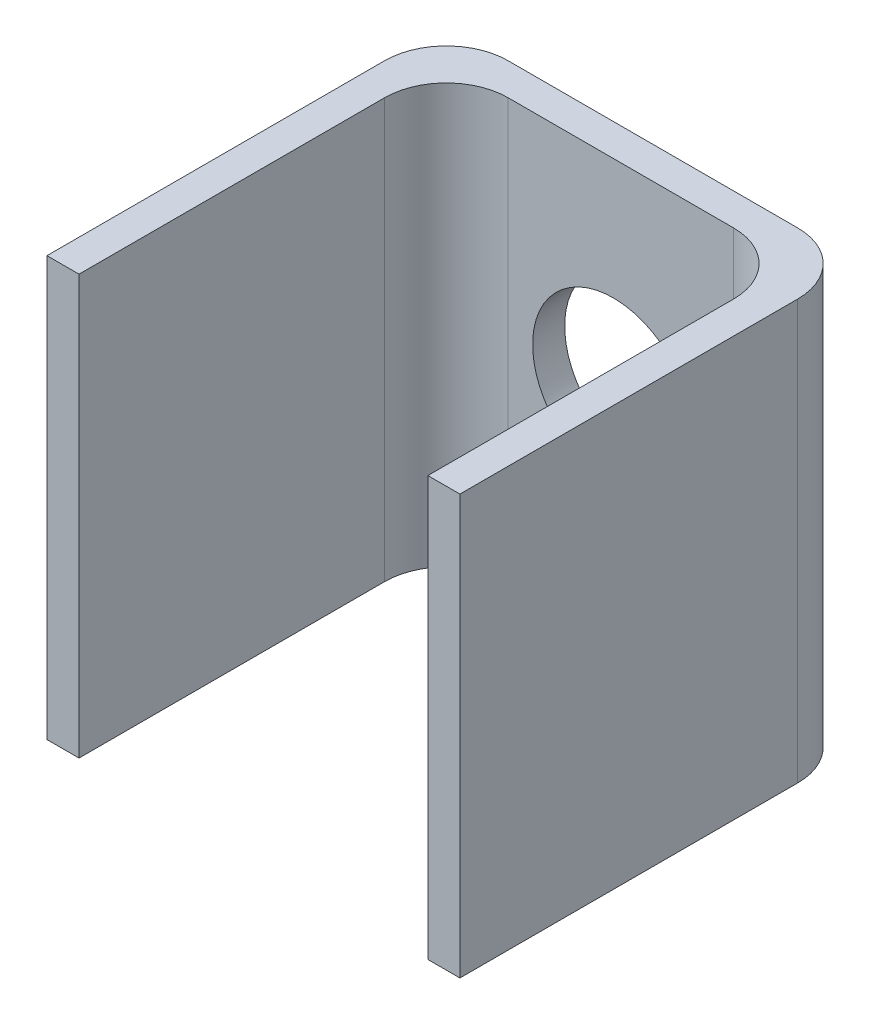
ISO-10303-21;
HEADER;
FILE_DESCRIPTION(('STEP AP214'),'2;1');
FILE_NAME('part.step','',(''),(''),'','','');
FILE_SCHEMA(('AUTOMOTIVE_DESIGN { 1 0 10303 214 1 1 1 1 }'));
ENDSEC;
DATA;
#1=APPLICATION_CONTEXT('core data for automotive mechanical design processes');
#2=APPLICATION_PROTOCOL_DEFINITION('international standard','automotive_design',2000,#1);
#3=PRODUCT_CONTEXT('',#1,'mechanical');
#4=PRODUCT('Part','Part','',(#3));
#5=PRODUCT_RELATED_PRODUCT_CATEGORY('part','',(#4));
#6=PRODUCT_DEFINITION_FORMATION('','',#4);
#7=PRODUCT_DEFINITION_CONTEXT('part definition',#1,'design');
#8=PRODUCT_DEFINITION('design','',#6,#7);
#9=PRODUCT_DEFINITION_SHAPE('','',#8);
#10=(LENGTH_UNIT() NAMED_UNIT(*) SI_UNIT(.MILLI.,.METRE.));
#11=(NAMED_UNIT(*) PLANE_ANGLE_UNIT() SI_UNIT($,.RADIAN.));
#12=(NAMED_UNIT(*) SI_UNIT($,.STERADIAN.) SOLID_ANGLE_UNIT());
#13=UNCERTAINTY_MEASURE_WITH_UNIT(LENGTH_MEASURE(1.E-05),#10,'distance_accuracy_value','');
#14=(GEOMETRIC_REPRESENTATION_CONTEXT(3) GLOBAL_UNCERTAINTY_ASSIGNED_CONTEXT((#13)) GLOBAL_UNIT_ASSIGNED_CONTEXT((#10,
#11,#12)) REPRESENTATION_CONTEXT('',''));
#15=CARTESIAN_POINT('',(0.,0.,0.));
#16=DIRECTION('',(0.,0.,1.));
#17=DIRECTION('',(1.,0.,0.));
#18=AXIS2_PLACEMENT_3D('',#15,#16,#17);
#19=CARTESIAN_POINT('',(-5.74929172377862,2.7494592022072,1.27));
#20=DIRECTION('',(0.,1.,0.));
#21=DIRECTION('',(0.,0.,1.));
#22=AXIS2_PLACEMENT_3D('',#19,#20,#21);
#23=CYLINDRICAL_SURFACE('',#22,1.27);
#24=CARTESIAN_POINT('',(-5.74929172377862,11.3854592022072,1.27));
#25=DIRECTION('',(0.,1.,0.));
#26=DIRECTION('',(0.,0.,1.));
#27=AXIS2_PLACEMENT_3D('',#24,#25,#26);
#28=CIRCLE('',#27,1.27);
#29=CARTESIAN_POINT('',(-4.47929172377862,11.3854592022072,1.27));
#30=VERTEX_POINT('',#29);
#31=CARTESIAN_POINT('',(-5.74929172377862,11.3854592022072,0.));
#32=VERTEX_POINT('',#31);
#33=EDGE_CURVE('E153',#30,#32,#28,.T.);
#34=ORIENTED_EDGE('',*,*,#33,.F.);
#35=DIRECTION('',(0.,1.,0.));
#36=VECTOR('',#35,1.);
#37=CARTESIAN_POINT('',(-4.47929172377862,2.7494592022072,1.27));
#38=LINE('',#37,#36);
#39=CARTESIAN_POINT('',(-4.47929172377862,2.7494592022072,1.27));
#40=VERTEX_POINT('',#39);
#41=EDGE_CURVE('E11',#40,#30,#38,.T.);
#42=ORIENTED_EDGE('',*,*,#41,.F.);
#43=CARTESIAN_POINT('',(-5.74929172377862,2.7494592022072,1.27));
#44=DIRECTION('',(0.,1.,0.));
#45=DIRECTION('',(0.,0.,1.));
#46=AXIS2_PLACEMENT_3D('',#43,#44,#45);
#47=CIRCLE('',#46,1.27);
#48=CARTESIAN_POINT('',(-5.74929172377862,2.7494592022072,0.));
#49=VERTEX_POINT('',#48);
#50=EDGE_CURVE('E186',#40,#49,#47,.T.);
#51=ORIENTED_EDGE('',*,*,#50,.T.);
#52=DIRECTION('',(0.,1.,0.));
#53=VECTOR('',#52,1.);
#54=CARTESIAN_POINT('',(-5.74929172377862,2.7494592022072,0.));
#55=LINE('',#54,#53);
#56=EDGE_CURVE('E35',#49,#32,#55,.T.);
#57=ORIENTED_EDGE('',*,*,#56,.T.);
#58=EDGE_LOOP('',(#34,#42,#51,#57));
#59=FACE_BOUND('',#58,.T.);
#60=ADVANCED_FACE('F32',(#59),#23,.T.);
#61=CARTESIAN_POINT('',(-4.47929172377862,2.7494592022072,8.2296));
#62=DIRECTION('',(1.,0.,0.));
#63=DIRECTION('',(0.,0.,-1.));
#64=AXIS2_PLACEMENT_3D('',#61,#62,#63);
#65=PLANE('',#64);
#66=DIRECTION('',(0.,0.,-1.));
#67=VECTOR('',#66,1.);
#68=CARTESIAN_POINT('',(-4.47929172377862,11.3854592022072,8.2296));
#69=LINE('',#68,#67);
#70=CARTESIAN_POINT('',(-4.47929172377862,11.3854592022072,8.2296));
#71=VERTEX_POINT('',#70);
#72=EDGE_CURVE('E184',#71,#30,#69,.T.);
#73=ORIENTED_EDGE('',*,*,#72,.F.);
#74=DIRECTION('',(0.,1.,0.));
#75=VECTOR('',#74,1.);
#76=CARTESIAN_POINT('',(-4.47929172377862,2.7494592022072,8.2296));
#77=LINE('',#76,#75);
#78=CARTESIAN_POINT('',(-4.47929172377862,2.7494592022072,8.2296));
#79=VERTEX_POINT('',#78);
#80=EDGE_CURVE('E41',#79,#71,#77,.T.);
#81=ORIENTED_EDGE('',*,*,#80,.F.);
#82=DIRECTION('',(0.,0.,-1.));
#83=VECTOR('',#82,1.);
#84=CARTESIAN_POINT('',(-4.47929172377862,2.7494592022072,8.2296));
#85=LINE('',#84,#83);
#86=EDGE_CURVE('E143',#79,#40,#85,.T.);
#87=ORIENTED_EDGE('',*,*,#86,.T.);
#88=ORIENTED_EDGE('',*,*,#41,.T.);
#89=EDGE_LOOP('',(#73,#81,#87,#88));
#90=FACE_BOUND('',#89,.T.);
#91=ADVANCED_FACE('F206',(#90),#65,.T.);
#92=CARTESIAN_POINT('',(-5.13969172377862,2.7494592022072,8.2296));
#93=DIRECTION('',(0.,0.,1.));
#94=DIRECTION('',(1.,0.,0.));
#95=AXIS2_PLACEMENT_3D('',#92,#93,#94);
#96=PLANE('',#95);
#97=DIRECTION('',(1.,0.,0.));
#98=VECTOR('',#97,1.);
#99=CARTESIAN_POINT('',(-5.13969172377862,11.3854592022072,8.2296));
#100=LINE('',#99,#98);
#101=CARTESIAN_POINT('',(-5.13969172377862,11.3854592022072,8.2296));
#102=VERTEX_POINT('',#101);
#103=EDGE_CURVE('E130',#102,#71,#100,.T.);
#104=ORIENTED_EDGE('',*,*,#103,.F.);
#105=DIRECTION('',(0.,1.,0.));
#106=VECTOR('',#105,1.);
#107=CARTESIAN_POINT('',(-5.13969172377862,2.7494592022072,8.2296));
#108=LINE('',#107,#106);
#109=CARTESIAN_POINT('',(-5.13969172377862,2.7494592022072,8.2296));
#110=VERTEX_POINT('',#109);
#111=EDGE_CURVE('E125',#110,#102,#108,.T.);
#112=ORIENTED_EDGE('',*,*,#111,.F.);
#113=DIRECTION('',(1.,0.,0.));
#114=VECTOR('',#113,1.);
#115=CARTESIAN_POINT('',(-5.13969172377862,2.7494592022072,8.2296));
#116=LINE('',#115,#114);
#117=EDGE_CURVE('E128',#110,#79,#116,.T.);
#118=ORIENTED_EDGE('',*,*,#117,.T.);
#119=ORIENTED_EDGE('',*,*,#80,.T.);
#120=EDGE_LOOP('',(#104,#112,#118,#119));
#121=FACE_BOUND('',#120,.T.);
#122=ADVANCED_FACE('F127',(#121),#96,.T.);
#123=CARTESIAN_POINT('',(-5.13969172377862,2.7494592022072,1.9304));
#124=DIRECTION('',(-1.,0.,0.));
#125=DIRECTION('',(0.,0.,1.));
#126=AXIS2_PLACEMENT_3D('',#123,#124,#125);
#127=PLANE('',#126);
#128=DIRECTION('',(0.,0.,1.));
#129=VECTOR('',#128,1.);
#130=CARTESIAN_POINT('',(-5.13969172377862,11.3854592022072,1.9304));
#131=LINE('',#130,#129);
#132=CARTESIAN_POINT('',(-5.13969172377862,11.3854592022072,1.9304));
#133=VERTEX_POINT('',#132);
#134=EDGE_CURVE('E181',#133,#102,#131,.T.);
#135=ORIENTED_EDGE('',*,*,#134,.F.);
#136=DIRECTION('',(0.,1.,0.));
#137=VECTOR('',#136,1.);
#138=CARTESIAN_POINT('',(-5.13969172377862,2.7494592022072,1.9304));
#139=LINE('',#138,#137);
#140=CARTESIAN_POINT('',(-5.13969172377862,2.7494592022072,1.9304));
#141=VERTEX_POINT('',#140);
#142=EDGE_CURVE('E135',#141,#133,#139,.T.);
#143=ORIENTED_EDGE('',*,*,#142,.F.);
#144=DIRECTION('',(0.,0.,1.));
#145=VECTOR('',#144,1.);
#146=CARTESIAN_POINT('',(-5.13969172377862,2.7494592022072,1.9304));
#147=LINE('',#146,#145);
#148=EDGE_CURVE('E141',#141,#110,#147,.T.);
#149=ORIENTED_EDGE('',*,*,#148,.T.);
#150=ORIENTED_EDGE('',*,*,#111,.T.);
#151=EDGE_LOOP('',(#135,#143,#149,#150));
#152=FACE_BOUND('',#151,.T.);
#153=ADVANCED_FACE('F145',(#152),#127,.T.);
#154=CARTESIAN_POINT('',(-6.40969172377862,2.7494592022072,1.9304));
#155=DIRECTION('',(0.,1.,0.));
#156=DIRECTION('',(0.,0.,1.));
#157=AXIS2_PLACEMENT_3D('',#154,#155,#156);
#158=CYLINDRICAL_SURFACE('',#157,1.27);
#159=CARTESIAN_POINT('',(-6.40969172377862,11.3854592022072,1.9304));
#160=DIRECTION('',(0.,-1.,0.));
#161=DIRECTION('',(0.,0.,-1.));
#162=AXIS2_PLACEMENT_3D('',#159,#160,#161);
#163=CIRCLE('',#162,1.27);
#164=CARTESIAN_POINT('',(-6.40969172377862,11.3854592022072,0.660399999999999));
#165=VERTEX_POINT('',#164);
#166=EDGE_CURVE('E178',#165,#133,#163,.T.);
#167=ORIENTED_EDGE('',*,*,#166,.F.);
#168=DIRECTION('',(0.,1.,0.));
#169=VECTOR('',#168,1.);
#170=CARTESIAN_POINT('',(-6.40969172377862,2.7494592022072,0.660399999999999));
#171=LINE('',#170,#169);
#172=CARTESIAN_POINT('',(-6.40969172377862,2.7494592022072,0.660399999999999));
#173=VERTEX_POINT('',#172);
#174=EDGE_CURVE('E190',#173,#165,#171,.T.);
#175=ORIENTED_EDGE('',*,*,#174,.F.);
#176=CARTESIAN_POINT('',(-6.40969172377862,2.7494592022072,1.9304));
#177=DIRECTION('',(0.,-1.,0.));
#178=DIRECTION('',(0.,0.,-1.));
#179=AXIS2_PLACEMENT_3D('',#176,#177,#178);
#180=CIRCLE('',#179,1.27);
#181=EDGE_CURVE('E146',#173,#141,#180,.T.);
#182=ORIENTED_EDGE('',*,*,#181,.T.);
#183=ORIENTED_EDGE('',*,*,#142,.T.);
#184=EDGE_LOOP('',(#167,#175,#182,#183));
#185=FACE_BOUND('',#184,.T.);
#186=ADVANCED_FACE('F219',(#185),#158,.F.);
#187=CARTESIAN_POINT('',(-11.0578917237786,2.7494592022072,0.6604));
#188=DIRECTION('',(0.,0.,1.));
#189=DIRECTION('',(1.,0.,0.));
#190=AXIS2_PLACEMENT_3D('',#187,#188,#189);
#191=PLANE('',#190);
#192=CARTESIAN_POINT('',(-8.88650548831843,7.23419417786932,0.660400000000001));
#193=DIRECTION('',(0.,0.,1.));
#194=DIRECTION('',(1.,0.,0.));
#195=AXIS2_PLACEMENT_3D('',#192,#193,#194);
#196=CIRCLE('',#195,1.66370000000001);
#197=CARTESIAN_POINT('',(-7.22280548831841,7.23419417786932,0.660400000000001));
#198=VERTEX_POINT('',#197);
#199=EDGE_CURVE('E254',#198,#198,#196,.T.);
#200=ORIENTED_EDGE('',*,*,#199,.F.);
#201=EDGE_LOOP('',(#200));
#202=FACE_BOUND('',#201,.T.);
#203=DIRECTION('',(1.,0.,0.));
#204=VECTOR('',#203,1.);
#205=CARTESIAN_POINT('',(-11.0578917237786,11.3854592022072,0.6604));
#206=LINE('',#205,#204);
#207=CARTESIAN_POINT('',(-11.0578917237786,11.3854592022072,0.6604));
#208=VERTEX_POINT('',#207);
#209=EDGE_CURVE('E175',#208,#165,#206,.T.);
#210=ORIENTED_EDGE('',*,*,#209,.F.);
#211=DIRECTION('',(0.,1.,0.));
#212=VECTOR('',#211,1.);
#213=CARTESIAN_POINT('',(-11.0578917237786,2.7494592022072,0.6604));
#214=LINE('',#213,#212);
#215=CARTESIAN_POINT('',(-11.0578917237786,2.7494592022072,0.6604));
#216=VERTEX_POINT('',#215);
#217=EDGE_CURVE('E192',#216,#208,#214,.T.);
#218=ORIENTED_EDGE('',*,*,#217,.F.);
#219=DIRECTION('',(1.,0.,0.));
#220=VECTOR('',#219,1.);
#221=CARTESIAN_POINT('',(-11.0578917237786,2.7494592022072,0.6604));
#222=LINE('',#221,#220);
#223=EDGE_CURVE('E148',#216,#173,#222,.T.);
#224=ORIENTED_EDGE('',*,*,#223,.T.);
#225=ORIENTED_EDGE('',*,*,#174,.T.);
#226=EDGE_LOOP('',(#210,#218,#224,#225));
#227=FACE_BOUND('',#226,.T.);
#228=ADVANCED_FACE('F222',(#202,#227),#191,.T.);
#229=CARTESIAN_POINT('',(-11.0578917237786,2.7494592022072,1.9304));
#230=DIRECTION('',(0.,1.,0.));
#231=DIRECTION('',(0.,0.,1.));
#232=AXIS2_PLACEMENT_3D('',#229,#230,#231);
#233=CYLINDRICAL_SURFACE('',#232,1.27);
#234=CARTESIAN_POINT('',(-11.0578917237786,11.3854592022072,1.9304));
#235=DIRECTION('',(0.,-1.,0.));
#236=DIRECTION('',(0.,0.,-1.));
#237=AXIS2_PLACEMENT_3D('',#234,#235,#236);
#238=CIRCLE('',#237,1.27);
#239=CARTESIAN_POINT('',(-12.3278917237786,11.3854592022072,1.9304));
#240=VERTEX_POINT('',#239);
#241=EDGE_CURVE('E172',#240,#208,#238,.T.);
#242=ORIENTED_EDGE('',*,*,#241,.F.);
#243=DIRECTION('',(0.,1.,0.));
#244=VECTOR('',#243,1.);
#245=CARTESIAN_POINT('',(-12.3278917237786,2.7494592022072,1.9304));
#246=LINE('',#245,#244);
#247=CARTESIAN_POINT('',(-12.3278917237786,2.7494592022072,1.9304));
#248=VERTEX_POINT('',#247);
#249=EDGE_CURVE('E194',#248,#240,#246,.T.);
#250=ORIENTED_EDGE('',*,*,#249,.F.);
#251=CARTESIAN_POINT('',(-11.0578917237786,2.7494592022072,1.9304));
#252=DIRECTION('',(0.,-1.,0.));
#253=DIRECTION('',(0.,0.,-1.));
#254=AXIS2_PLACEMENT_3D('',#251,#252,#253);
#255=CIRCLE('',#254,1.27);
#256=EDGE_CURVE('E274',#248,#216,#255,.T.);
#257=ORIENTED_EDGE('',*,*,#256,.T.);
#258=ORIENTED_EDGE('',*,*,#217,.T.);
#259=EDGE_LOOP('',(#242,#250,#257,#258));
#260=FACE_BOUND('',#259,.T.);
#261=ADVANCED_FACE('F226',(#260),#233,.F.);
#262=CARTESIAN_POINT('',(-12.3278917237786,2.7494592022072,8.2296));
#263=DIRECTION('',(1.,0.,0.));
#264=DIRECTION('',(0.,0.,-1.));
#265=AXIS2_PLACEMENT_3D('',#262,#263,#264);
#266=PLANE('',#265);
#267=DIRECTION('',(0.,0.,-1.));
#268=VECTOR('',#267,1.);
#269=CARTESIAN_POINT('',(-12.3278917237786,11.3854592022072,8.2296));
#270=LINE('',#269,#268);
#271=CARTESIAN_POINT('',(-12.3278917237786,11.3854592022072,8.2296));
#272=VERTEX_POINT('',#271);
#273=EDGE_CURVE('E169',#272,#240,#270,.T.);
#274=ORIENTED_EDGE('',*,*,#273,.F.);
#275=DIRECTION('',(0.,1.,0.));
#276=VECTOR('',#275,1.);
#277=CARTESIAN_POINT('',(-12.3278917237786,2.7494592022072,8.2296));
#278=LINE('',#277,#276);
#279=CARTESIAN_POINT('',(-12.3278917237786,2.7494592022072,8.2296));
#280=VERTEX_POINT('',#279);
#281=EDGE_CURVE('E196',#280,#272,#278,.T.);
#282=ORIENTED_EDGE('',*,*,#281,.F.);
#283=DIRECTION('',(0.,0.,-1.));
#284=VECTOR('',#283,1.);
#285=CARTESIAN_POINT('',(-12.3278917237786,2.7494592022072,8.2296));
#286=LINE('',#285,#284);
#287=EDGE_CURVE('E271',#280,#248,#286,.T.);
#288=ORIENTED_EDGE('',*,*,#287,.T.);
#289=ORIENTED_EDGE('',*,*,#249,.T.);
#290=EDGE_LOOP('',(#274,#282,#288,#289));
#291=FACE_BOUND('',#290,.T.);
#292=ADVANCED_FACE('F230',(#291),#266,.T.);
#293=CARTESIAN_POINT('',(-12.9882917237786,2.7494592022072,8.2296));
#294=DIRECTION('',(0.,0.,1.));
#295=DIRECTION('',(1.,0.,0.));
#296=AXIS2_PLACEMENT_3D('',#293,#294,#295);
#297=PLANE('',#296);
#298=DIRECTION('',(1.,0.,0.));
#299=VECTOR('',#298,1.);
#300=CARTESIAN_POINT('',(-12.9882917237786,11.3854592022072,8.2296));
#301=LINE('',#300,#299);
#302=CARTESIAN_POINT('',(-12.9882917237786,11.3854592022072,8.2296));
#303=VERTEX_POINT('',#302);
#304=EDGE_CURVE('E166',#303,#272,#301,.T.);
#305=ORIENTED_EDGE('',*,*,#304,.F.);
#306=DIRECTION('',(0.,1.,0.));
#307=VECTOR('',#306,1.);
#308=CARTESIAN_POINT('',(-12.9882917237786,2.7494592022072,8.2296));
#309=LINE('',#308,#307);
#310=CARTESIAN_POINT('',(-12.9882917237786,2.7494592022072,8.2296));
#311=VERTEX_POINT('',#310);
#312=EDGE_CURVE('E198',#311,#303,#309,.T.);
#313=ORIENTED_EDGE('',*,*,#312,.F.);
#314=DIRECTION('',(1.,0.,0.));
#315=VECTOR('',#314,1.);
#316=CARTESIAN_POINT('',(-12.9882917237786,2.7494592022072,8.2296));
#317=LINE('',#316,#315);
#318=EDGE_CURVE('E268',#311,#280,#317,.T.);
#319=ORIENTED_EDGE('',*,*,#318,.T.);
#320=ORIENTED_EDGE('',*,*,#281,.T.);
#321=EDGE_LOOP('',(#305,#313,#319,#320));
#322=FACE_BOUND('',#321,.T.);
#323=ADVANCED_FACE('F234',(#322),#297,.T.);
#324=CARTESIAN_POINT('',(-12.9882917237786,2.7494592022072,1.27));
#325=DIRECTION('',(-1.,0.,0.));
#326=DIRECTION('',(0.,0.,1.));
#327=AXIS2_PLACEMENT_3D('',#324,#325,#326);
#328=PLANE('',#327);
#329=DIRECTION('',(0.,0.,1.));
#330=VECTOR('',#329,1.);
#331=CARTESIAN_POINT('',(-12.9882917237786,11.3854592022072,1.27));
#332=LINE('',#331,#330);
#333=CARTESIAN_POINT('',(-12.9882917237786,11.3854592022072,1.27));
#334=VERTEX_POINT('',#333);
#335=EDGE_CURVE('E163',#334,#303,#332,.T.);
#336=ORIENTED_EDGE('',*,*,#335,.F.);
#337=DIRECTION('',(0.,1.,0.));
#338=VECTOR('',#337,1.);
#339=CARTESIAN_POINT('',(-12.9882917237786,2.7494592022072,1.27));
#340=LINE('',#339,#338);
#341=CARTESIAN_POINT('',(-12.9882917237786,2.7494592022072,1.27));
#342=VERTEX_POINT('',#341);
#343=EDGE_CURVE('E200',#342,#334,#340,.T.);
#344=ORIENTED_EDGE('',*,*,#343,.F.);
#345=DIRECTION('',(0.,0.,1.));
#346=VECTOR('',#345,1.);
#347=CARTESIAN_POINT('',(-12.9882917237786,2.7494592022072,1.27));
#348=LINE('',#347,#346);
#349=EDGE_CURVE('E265',#342,#311,#348,.T.);
#350=ORIENTED_EDGE('',*,*,#349,.T.);
#351=ORIENTED_EDGE('',*,*,#312,.T.);
#352=EDGE_LOOP('',(#336,#344,#350,#351));
#353=FACE_BOUND('',#352,.T.);
#354=ADVANCED_FACE('F238',(#353),#328,.T.);
#355=CARTESIAN_POINT('',(-11.7182917237786,2.7494592022072,1.27));
#356=DIRECTION('',(0.,1.,0.));
#357=DIRECTION('',(0.,0.,1.));
#358=AXIS2_PLACEMENT_3D('',#355,#356,#357);
#359=CYLINDRICAL_SURFACE('',#358,1.27);
#360=CARTESIAN_POINT('',(-11.7182917237786,11.3854592022072,1.27));
#361=DIRECTION('',(0.,1.,0.));
#362=DIRECTION('',(0.,0.,1.));
#363=AXIS2_PLACEMENT_3D('',#360,#361,#362);
#364=CIRCLE('',#363,1.27);
#365=CARTESIAN_POINT('',(-11.7182917237786,11.3854592022072,0.));
#366=VERTEX_POINT('',#365);
#367=EDGE_CURVE('E160',#366,#334,#364,.T.);
#368=ORIENTED_EDGE('',*,*,#367,.F.);
#369=DIRECTION('',(0.,1.,0.));
#370=VECTOR('',#369,1.);
#371=CARTESIAN_POINT('',(-11.7182917237786,2.7494592022072,0.));
#372=LINE('',#371,#370);
#373=CARTESIAN_POINT('',(-11.7182917237786,2.7494592022072,0.));
#374=VERTEX_POINT('',#373);
#375=EDGE_CURVE('E201',#374,#366,#372,.T.);
#376=ORIENTED_EDGE('',*,*,#375,.F.);
#377=CARTESIAN_POINT('',(-11.7182917237786,2.7494592022072,1.27));
#378=DIRECTION('',(0.,1.,0.));
#379=DIRECTION('',(0.,0.,1.));
#380=AXIS2_PLACEMENT_3D('',#377,#378,#379);
#381=CIRCLE('',#380,1.27);
#382=EDGE_CURVE('E262',#374,#342,#381,.T.);
#383=ORIENTED_EDGE('',*,*,#382,.T.);
#384=ORIENTED_EDGE('',*,*,#343,.T.);
#385=EDGE_LOOP('',(#368,#376,#383,#384));
#386=FACE_BOUND('',#385,.T.);
#387=ADVANCED_FACE('F242',(#386),#359,.T.);
#388=CARTESIAN_POINT('',(-5.74929172377862,2.7494592022072,0.));
#389=DIRECTION('',(0.,0.,-1.));
#390=DIRECTION('',(-1.,0.,0.));
#391=AXIS2_PLACEMENT_3D('',#388,#389,#390);
#392=PLANE('',#391);
#393=CARTESIAN_POINT('',(-8.88650548831843,7.23419417786932,0.));
#394=DIRECTION('',(0.,0.,1.));
#395=DIRECTION('',(1.,0.,0.));
#396=AXIS2_PLACEMENT_3D('',#393,#394,#395);
#397=CIRCLE('',#396,1.66370000000001);
#398=CARTESIAN_POINT('',(-7.22280548831841,7.23419417786932,0.));
#399=VERTEX_POINT('',#398);
#400=EDGE_CURVE('E157',#399,#399,#397,.T.);
#401=ORIENTED_EDGE('',*,*,#400,.T.);
#402=EDGE_LOOP('',(#401));
#403=FACE_BOUND('',#402,.T.);
#404=DIRECTION('',(-1.,0.,0.));
#405=VECTOR('',#404,1.);
#406=CARTESIAN_POINT('',(-5.74929172377862,11.3854592022072,0.));
#407=LINE('',#406,#405);
#408=EDGE_CURVE('E156',#32,#366,#407,.T.);
#409=ORIENTED_EDGE('',*,*,#408,.F.);
#410=ORIENTED_EDGE('',*,*,#56,.F.);
#411=DIRECTION('',(-1.,0.,0.));
#412=VECTOR('',#411,1.);
#413=CARTESIAN_POINT('',(-5.74929172377862,2.7494592022072,0.));
#414=LINE('',#413,#412);
#415=EDGE_CURVE('E260',#49,#374,#414,.T.);
#416=ORIENTED_EDGE('',*,*,#415,.T.);
#417=ORIENTED_EDGE('',*,*,#375,.T.);
#418=EDGE_LOOP('',(#409,#410,#416,#417));
#419=FACE_BOUND('',#418,.T.);
#420=ADVANCED_FACE('F203',(#403,#419),#392,.T.);
#421=CARTESIAN_POINT('',(-5.74929172377862,2.7494592022072,1.27));
#422=DIRECTION('',(0.,1.,0.));
#423=DIRECTION('',(0.,0.,1.));
#424=AXIS2_PLACEMENT_3D('',#421,#422,#423);
#425=PLANE('',#424);
#426=ORIENTED_EDGE('',*,*,#50,.F.);
#427=ORIENTED_EDGE('',*,*,#86,.F.);
#428=ORIENTED_EDGE('',*,*,#117,.F.);
#429=ORIENTED_EDGE('',*,*,#148,.F.);
#430=ORIENTED_EDGE('',*,*,#181,.F.);
#431=ORIENTED_EDGE('',*,*,#223,.F.);
#432=ORIENTED_EDGE('',*,*,#256,.F.);
#433=ORIENTED_EDGE('',*,*,#287,.F.);
#434=ORIENTED_EDGE('',*,*,#318,.F.);
#435=ORIENTED_EDGE('',*,*,#349,.F.);
#436=ORIENTED_EDGE('',*,*,#382,.F.);
#437=ORIENTED_EDGE('',*,*,#415,.F.);
#438=EDGE_LOOP('',(#426,#427,#428,#429,#430,#431,#432,#433,#434,#435,#436,#437));
#439=FACE_BOUND('',#438,.T.);
#440=ADVANCED_FACE('F139',(#439),#425,.F.);
#441=CARTESIAN_POINT('',(-5.74929172377862,11.3854592022072,1.27));
#442=DIRECTION('',(0.,1.,0.));
#443=DIRECTION('',(0.,0.,1.));
#444=AXIS2_PLACEMENT_3D('',#441,#442,#443);
#445=PLANE('',#444);
#446=ORIENTED_EDGE('',*,*,#33,.T.);
#447=ORIENTED_EDGE('',*,*,#408,.T.);
#448=ORIENTED_EDGE('',*,*,#367,.T.);
#449=ORIENTED_EDGE('',*,*,#335,.T.);
#450=ORIENTED_EDGE('',*,*,#304,.T.);
#451=ORIENTED_EDGE('',*,*,#273,.T.);
#452=ORIENTED_EDGE('',*,*,#241,.T.);
#453=ORIENTED_EDGE('',*,*,#209,.T.);
#454=ORIENTED_EDGE('',*,*,#166,.T.);
#455=ORIENTED_EDGE('',*,*,#134,.T.);
#456=ORIENTED_EDGE('',*,*,#103,.T.);
#457=ORIENTED_EDGE('',*,*,#72,.T.);
#458=EDGE_LOOP('',(#446,#447,#448,#449,#450,#451,#452,#453,#454,#455,#456,#457));
#459=FACE_BOUND('',#458,.T.);
#460=ADVANCED_FACE('F205',(#459),#445,.T.);
#461=CARTESIAN_POINT('',(-8.88650548831843,7.23419417786932,0.6604));
#462=DIRECTION('',(0.,0.,1.));
#463=DIRECTION('',(1.,0.,0.));
#464=AXIS2_PLACEMENT_3D('',#461,#462,#463);
#465=CYLINDRICAL_SURFACE('',#464,1.66370000000001);
#466=ORIENTED_EDGE('',*,*,#400,.F.);
#467=EDGE_LOOP('',(#466));
#468=FACE_BOUND('',#467,.T.);
#469=ORIENTED_EDGE('',*,*,#199,.T.);
#470=EDGE_LOOP('',(#469));
#471=FACE_BOUND('',#470,.T.);
#472=ADVANCED_FACE('F292',(#468,#471),#465,.F.);
#473=CLOSED_SHELL('',(#60,#91,#122,#153,#186,#228,#261,#292,#323,#354,#387,#420,#440,#460,#472));
#474=MANIFOLD_SOLID_BREP('B2',#473);
#475=ADVANCED_BREP_SHAPE_REPRESENTATION('',(#18,#474),#14);
#476=SHAPE_DEFINITION_REPRESENTATION(#9,#475);
ENDSEC;
END-ISO-10303-21;
